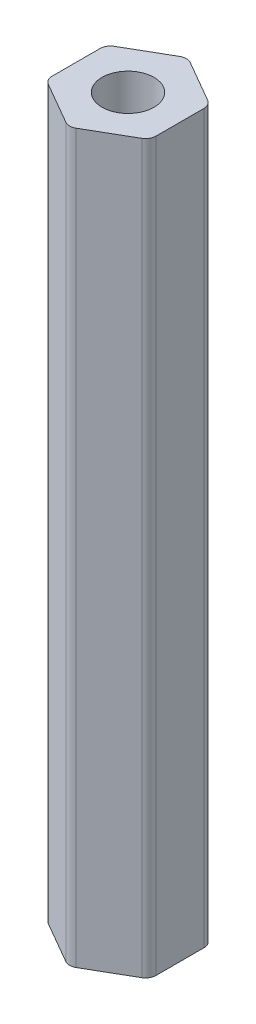
ISO-10303-21;
HEADER;
FILE_DESCRIPTION(('STEP AP214'),'2;1');
FILE_NAME('part.step','',(''),(''),'','','');
FILE_SCHEMA(('AUTOMOTIVE_DESIGN { 1 0 10303 214 1 1 1 1 }'));
ENDSEC;
DATA;
#1=APPLICATION_CONTEXT('core data for automotive mechanical design processes');
#2=APPLICATION_PROTOCOL_DEFINITION('international standard','automotive_design',2000,#1);
#3=PRODUCT_CONTEXT('',#1,'mechanical');
#4=PRODUCT('Part','Part','',(#3));
#5=PRODUCT_RELATED_PRODUCT_CATEGORY('part','',(#4));
#6=PRODUCT_DEFINITION_FORMATION('','',#4);
#7=PRODUCT_DEFINITION_CONTEXT('part definition',#1,'design');
#8=PRODUCT_DEFINITION('design','',#6,#7);
#9=PRODUCT_DEFINITION_SHAPE('','',#8);
#10=(LENGTH_UNIT() NAMED_UNIT(*) SI_UNIT(.MILLI.,.METRE.));
#11=(NAMED_UNIT(*) PLANE_ANGLE_UNIT() SI_UNIT($,.RADIAN.));
#12=(NAMED_UNIT(*) SI_UNIT($,.STERADIAN.) SOLID_ANGLE_UNIT());
#13=UNCERTAINTY_MEASURE_WITH_UNIT(LENGTH_MEASURE(1.E-05),#10,'distance_accuracy_value','');
#14=(GEOMETRIC_REPRESENTATION_CONTEXT(3) GLOBAL_UNCERTAINTY_ASSIGNED_CONTEXT((#13)) GLOBAL_UNIT_ASSIGNED_CONTEXT((#10,
#11,#12)) REPRESENTATION_CONTEXT('',''));
#15=CARTESIAN_POINT('',(0.,0.,0.));
#16=DIRECTION('',(0.,0.,1.));
#17=DIRECTION('',(1.,0.,0.));
#18=AXIS2_PLACEMENT_3D('',#15,#16,#17);
#19=CARTESIAN_POINT('',(0.,8.50000000002638,0.));
#20=DIRECTION('',(0.,-1.,0.));
#21=DIRECTION('',(0.,0.,-1.));
#22=AXIS2_PLACEMENT_3D('',#19,#20,#21);
#23=CONICAL_SURFACE('',#22,1.25000000002728,1.02974425862845);
#24=CARTESIAN_POINT('',(0.,9.25107577387507,0.));
#25=VERTEX_POINT('',#24);
#26=VERTEX_LOOP('',#25);
#27=FACE_BOUND('',#26,.T.);
#28=CARTESIAN_POINT('',(0.,8.49999999999999,0.));
#29=DIRECTION('',(0.,-1.,0.));
#30=DIRECTION('',(0.,0.,-1.));
#31=AXIS2_PLACEMENT_3D('',#28,#29,#30);
#32=CIRCLE('',#31,1.24999999999999);
#33=CARTESIAN_POINT('',(0.,8.49999999999999,-1.24999999999999));
#34=VERTEX_POINT('',#33);
#35=EDGE_CURVE('E186',#34,#34,#32,.T.);
#36=ORIENTED_EDGE('',*,*,#35,.T.);
#37=EDGE_LOOP('',(#36));
#38=FACE_BOUND('',#37,.T.);
#39=ADVANCED_FACE('F17',(#27,#38),#23,.F.);
#40=CARTESIAN_POINT('',(0.,26.4999999998281,0.));
#41=DIRECTION('',(0.,1.,0.));
#42=DIRECTION('',(-1.,0.,0.));
#43=AXIS2_PLACEMENT_3D('',#40,#41,#42);
#44=CONICAL_SURFACE('',#43,1.24999999979991,1.02974425852133);
#45=CARTESIAN_POINT('',(0.,25.7489242260647,-5.6843418860808E-11));
#46=VERTEX_POINT('',#45);
#47=VERTEX_LOOP('',#46);
#48=FACE_BOUND('',#47,.T.);
#49=CARTESIAN_POINT('',(0.,26.5,0.));
#50=DIRECTION('',(0.,1.,0.));
#51=DIRECTION('',(0.,0.,1.));
#52=AXIS2_PLACEMENT_3D('',#49,#50,#51);
#53=CIRCLE('',#52,1.24999999999999);
#54=CARTESIAN_POINT('',(0.,26.5,1.24999999999999));
#55=VERTEX_POINT('',#54);
#56=EDGE_CURVE('E182',#55,#55,#53,.T.);
#57=ORIENTED_EDGE('',*,*,#56,.T.);
#58=EDGE_LOOP('',(#57));
#59=FACE_BOUND('',#58,.T.);
#60=ADVANCED_FACE('F386',(#48,#59),#44,.F.);
#61=CARTESIAN_POINT('',(2.00000000000001,35.,1.15470053837923));
#62=DIRECTION('',(0.,-1.,0.));
#63=DIRECTION('',(0.,0.,-1.));
#64=AXIS2_PLACEMENT_3D('',#61,#62,#63);
#65=CYLINDRICAL_SURFACE('',#64,0.5);
#66=CARTESIAN_POINT('',(2.00000000000001,0.,1.15470053837923));
#67=DIRECTION('',(0.,-1.,0.));
#68=DIRECTION('',(0.,0.,-1.));
#69=AXIS2_PLACEMENT_3D('',#66,#67,#68);
#70=CIRCLE('',#69,0.5);
#71=CARTESIAN_POINT('',(2.25000000000002,0.,1.58771324027145));
#72=VERTEX_POINT('',#71);
#73=CARTESIAN_POINT('',(2.50000000000001,0.,1.15470053837923));
#74=VERTEX_POINT('',#73);
#75=EDGE_CURVE('E111',#72,#74,#70,.F.);
#76=ORIENTED_EDGE('',*,*,#75,.T.);
#77=DIRECTION('',(0.,1.,0.));
#78=VECTOR('',#77,1.);
#79=CARTESIAN_POINT('',(2.50000000000001,35.,1.15470053837923));
#80=LINE('',#79,#78);
#81=CARTESIAN_POINT('',(2.50000000000001,35.,1.15470053837923));
#82=VERTEX_POINT('',#81);
#83=EDGE_CURVE('E109',#74,#82,#80,.T.);
#84=ORIENTED_EDGE('',*,*,#83,.T.);
#85=CARTESIAN_POINT('',(2.00000000000001,35.,1.15470053837923));
#86=DIRECTION('',(0.,-1.,0.));
#87=DIRECTION('',(0.,0.,-1.));
#88=AXIS2_PLACEMENT_3D('',#85,#86,#87);
#89=CIRCLE('',#88,0.5);
#90=CARTESIAN_POINT('',(2.25000000000002,35.,1.58771324027145));
#91=VERTEX_POINT('',#90);
#92=EDGE_CURVE('E20',#82,#91,#89,.T.);
#93=ORIENTED_EDGE('',*,*,#92,.T.);
#94=DIRECTION('',(0.,1.,0.));
#95=VECTOR('',#94,1.);
#96=CARTESIAN_POINT('',(2.25000000000002,35.,1.58771324027145));
#97=LINE('',#96,#95);
#98=EDGE_CURVE('E106',#91,#72,#97,.F.);
#99=ORIENTED_EDGE('',*,*,#98,.T.);
#100=EDGE_LOOP('',(#76,#84,#93,#99));
#101=FACE_BOUND('',#100,.T.);
#102=ADVANCED_FACE('F105',(#101),#65,.T.);
#103=CARTESIAN_POINT('',(1.99999999999999,35.,-1.15470053837928));
#104=DIRECTION('',(0.,-1.,0.));
#105=DIRECTION('',(0.,0.,-1.));
#106=AXIS2_PLACEMENT_3D('',#103,#104,#105);
#107=CYLINDRICAL_SURFACE('',#106,0.5);
#108=CARTESIAN_POINT('',(1.99999999999999,0.,-1.15470053837928));
#109=DIRECTION('',(0.,-1.,0.));
#110=DIRECTION('',(0.,0.,-1.));
#111=AXIS2_PLACEMENT_3D('',#108,#109,#110);
#112=CIRCLE('',#111,0.5);
#113=CARTESIAN_POINT('',(2.5,0.,-1.15470053837928));
#114=VERTEX_POINT('',#113);
#115=CARTESIAN_POINT('',(2.24999999999999,0.,-1.5877132402715));
#116=VERTEX_POINT('',#115);
#117=EDGE_CURVE('E206',#114,#116,#112,.F.);
#118=ORIENTED_EDGE('',*,*,#117,.T.);
#119=DIRECTION('',(0.,1.,0.));
#120=VECTOR('',#119,1.);
#121=CARTESIAN_POINT('',(2.24999999999999,35.,-1.5877132402715));
#122=LINE('',#121,#120);
#123=CARTESIAN_POINT('',(2.24999999999999,35.,-1.5877132402715));
#124=VERTEX_POINT('',#123);
#125=EDGE_CURVE('E171',#116,#124,#122,.T.);
#126=ORIENTED_EDGE('',*,*,#125,.T.);
#127=CARTESIAN_POINT('',(1.99999999999999,35.,-1.15470053837928));
#128=DIRECTION('',(0.,-1.,0.));
#129=DIRECTION('',(0.,0.,-1.));
#130=AXIS2_PLACEMENT_3D('',#127,#128,#129);
#131=CIRCLE('',#130,0.5);
#132=CARTESIAN_POINT('',(2.5,35.,-1.15470053837928));
#133=VERTEX_POINT('',#132);
#134=EDGE_CURVE('E208',#124,#133,#131,.T.);
#135=ORIENTED_EDGE('',*,*,#134,.T.);
#136=DIRECTION('',(0.,1.,0.));
#137=VECTOR('',#136,1.);
#138=CARTESIAN_POINT('',(2.49999999999999,35.,-1.15470053837928));
#139=LINE('',#138,#137);
#140=EDGE_CURVE('E119',#133,#114,#139,.F.);
#141=ORIENTED_EDGE('',*,*,#140,.T.);
#142=EDGE_LOOP('',(#118,#126,#135,#141));
#143=FACE_BOUND('',#142,.T.);
#144=ADVANCED_FACE('F219',(#143),#107,.T.);
#145=CARTESIAN_POINT('',(-2.,35.,1.15470053837926));
#146=DIRECTION('',(0.,-1.,0.));
#147=DIRECTION('',(0.,0.,-1.));
#148=AXIS2_PLACEMENT_3D('',#145,#146,#147);
#149=CYLINDRICAL_SURFACE('',#148,0.5);
#150=CARTESIAN_POINT('',(-2.,0.,1.15470053837926));
#151=DIRECTION('',(0.,-1.,0.));
#152=DIRECTION('',(0.,0.,-1.));
#153=AXIS2_PLACEMENT_3D('',#150,#151,#152);
#154=CIRCLE('',#153,0.5);
#155=CARTESIAN_POINT('',(-2.5,0.,1.15470053837926));
#156=VERTEX_POINT('',#155);
#157=CARTESIAN_POINT('',(-2.24999999999999,0.,1.58771324027148));
#158=VERTEX_POINT('',#157);
#159=EDGE_CURVE('E202',#156,#158,#154,.F.);
#160=ORIENTED_EDGE('',*,*,#159,.T.);
#161=DIRECTION('',(0.,1.,0.));
#162=VECTOR('',#161,1.);
#163=CARTESIAN_POINT('',(-2.24999999999999,35.,1.58771324027148));
#164=LINE('',#163,#162);
#165=CARTESIAN_POINT('',(-2.24999999999999,35.,1.58771324027148));
#166=VERTEX_POINT('',#165);
#167=EDGE_CURVE('E161',#158,#166,#164,.T.);
#168=ORIENTED_EDGE('',*,*,#167,.T.);
#169=CARTESIAN_POINT('',(-2.,35.,1.15470053837926));
#170=DIRECTION('',(0.,-1.,0.));
#171=DIRECTION('',(0.,0.,-1.));
#172=AXIS2_PLACEMENT_3D('',#169,#170,#171);
#173=CIRCLE('',#172,0.5);
#174=CARTESIAN_POINT('',(-2.5,35.,1.15470053837926));
#175=VERTEX_POINT('',#174);
#176=EDGE_CURVE('E204',#166,#175,#173,.T.);
#177=ORIENTED_EDGE('',*,*,#176,.T.);
#178=DIRECTION('',(0.,1.,0.));
#179=VECTOR('',#178,1.);
#180=CARTESIAN_POINT('',(-2.5,35.,1.15470053837926));
#181=LINE('',#180,#179);
#182=EDGE_CURVE('E165',#175,#156,#181,.F.);
#183=ORIENTED_EDGE('',*,*,#182,.T.);
#184=EDGE_LOOP('',(#160,#168,#177,#183));
#185=FACE_BOUND('',#184,.T.);
#186=ADVANCED_FACE('F238',(#185),#149,.T.);
#187=CARTESIAN_POINT('',(0.,35.,2.30940107675851));
#188=DIRECTION('',(0.,-1.,0.));
#189=DIRECTION('',(0.,0.,-1.));
#190=AXIS2_PLACEMENT_3D('',#187,#188,#189);
#191=CYLINDRICAL_SURFACE('',#190,0.5);
#192=CARTESIAN_POINT('',(0.,0.,2.30940107675851));
#193=DIRECTION('',(0.,-1.,0.));
#194=DIRECTION('',(0.,0.,-1.));
#195=AXIS2_PLACEMENT_3D('',#192,#193,#194);
#196=CIRCLE('',#195,0.5);
#197=CARTESIAN_POINT('',(-0.249999999999981,0.,2.74241377865073));
#198=VERTEX_POINT('',#197);
#199=CARTESIAN_POINT('',(0.250000000000019,0.,2.74241377865072));
#200=VERTEX_POINT('',#199);
#201=EDGE_CURVE('E189',#198,#200,#196,.F.);
#202=ORIENTED_EDGE('',*,*,#201,.T.);
#203=DIRECTION('',(0.,1.,0.));
#204=VECTOR('',#203,1.);
#205=CARTESIAN_POINT('',(0.25000000000002,35.,2.74241377865072));
#206=LINE('',#205,#204);
#207=CARTESIAN_POINT('',(0.250000000000019,35.,2.74241377865072));
#208=VERTEX_POINT('',#207);
#209=EDGE_CURVE('E120',#200,#208,#206,.T.);
#210=ORIENTED_EDGE('',*,*,#209,.T.);
#211=CARTESIAN_POINT('',(0.,35.,2.30940107675851));
#212=DIRECTION('',(0.,-1.,0.));
#213=DIRECTION('',(0.,0.,-1.));
#214=AXIS2_PLACEMENT_3D('',#211,#212,#213);
#215=CIRCLE('',#214,0.5);
#216=CARTESIAN_POINT('',(-0.249999999999981,35.,2.74241377865073));
#217=VERTEX_POINT('',#216);
#218=EDGE_CURVE('E125',#208,#217,#215,.T.);
#219=ORIENTED_EDGE('',*,*,#218,.T.);
#220=DIRECTION('',(0.,1.,0.));
#221=VECTOR('',#220,1.);
#222=CARTESIAN_POINT('',(-0.249999999999981,35.,2.74241377865073));
#223=LINE('',#222,#221);
#224=EDGE_CURVE('E164',#217,#198,#223,.F.);
#225=ORIENTED_EDGE('',*,*,#224,.T.);
#226=EDGE_LOOP('',(#202,#210,#219,#225));
#227=FACE_BOUND('',#226,.T.);
#228=ADVANCED_FACE('F234',(#227),#191,.T.);
#229=CARTESIAN_POINT('',(0.,0.,0.));
#230=DIRECTION('',(0.,-1.,0.));
#231=DIRECTION('',(0.,0.,-1.));
#232=AXIS2_PLACEMENT_3D('',#229,#230,#231);
#233=CYLINDRICAL_SURFACE('',#232,1.24999999999999);
#234=ORIENTED_EDGE('',*,*,#35,.F.);
#235=EDGE_LOOP('',(#234));
#236=FACE_BOUND('',#235,.T.);
#237=CARTESIAN_POINT('',(0.,0.,0.));
#238=DIRECTION('',(0.,-1.,0.));
#239=DIRECTION('',(0.,0.,-1.));
#240=AXIS2_PLACEMENT_3D('',#237,#238,#239);
#241=CIRCLE('',#240,1.24999999999999);
#242=CARTESIAN_POINT('',(0.,0.,-1.24999999999999));
#243=VERTEX_POINT('',#242);
#244=EDGE_CURVE('E160',#243,#243,#241,.T.);
#245=ORIENTED_EDGE('',*,*,#244,.T.);
#246=EDGE_LOOP('',(#245));
#247=FACE_BOUND('',#246,.T.);
#248=ADVANCED_FACE('F343',(#236,#247),#233,.F.);
#249=CARTESIAN_POINT('',(0.,35.,0.));
#250=DIRECTION('',(0.,1.,0.));
#251=DIRECTION('',(0.,0.,1.));
#252=AXIS2_PLACEMENT_3D('',#249,#250,#251);
#253=CYLINDRICAL_SURFACE('',#252,1.24999999999999);
#254=CARTESIAN_POINT('',(0.,35.,0.));
#255=DIRECTION('',(0.,1.,0.));
#256=DIRECTION('',(0.,0.,1.));
#257=AXIS2_PLACEMENT_3D('',#254,#255,#256);
#258=CIRCLE('',#257,1.24999999999999);
#259=CARTESIAN_POINT('',(0.,35.,1.24999999999999));
#260=VERTEX_POINT('',#259);
#261=EDGE_CURVE('E128',#260,#260,#258,.F.);
#262=ORIENTED_EDGE('',*,*,#261,.F.);
#263=EDGE_LOOP('',(#262));
#264=FACE_BOUND('',#263,.T.);
#265=ORIENTED_EDGE('',*,*,#56,.F.);
#266=EDGE_LOOP('',(#265));
#267=FACE_BOUND('',#266,.T.);
#268=ADVANCED_FACE('F333',(#264,#267),#253,.F.);
#269=CARTESIAN_POINT('',(0.,35.,2.88675134594813));
#270=DIRECTION('',(-0.500000000000007,0.,-0.866025403784435));
#271=DIRECTION('',(-0.866025403784435,0.,0.500000000000007));
#272=AXIS2_PLACEMENT_3D('',#269,#270,#271);
#273=PLANE('',#272);
#274=ORIENTED_EDGE('',*,*,#98,.F.);
#275=DIRECTION('',(0.866025403784434,0.,-0.500000000000007));
#276=VECTOR('',#275,1.);
#277=CARTESIAN_POINT('',(0.250000000000019,35.,2.74241377865072));
#278=LINE('',#277,#276);
#279=EDGE_CURVE('E116',#208,#91,#278,.T.);
#280=ORIENTED_EDGE('',*,*,#279,.F.);
#281=ORIENTED_EDGE('',*,*,#209,.F.);
#282=DIRECTION('',(0.866025403784434,0.,-0.500000000000007));
#283=VECTOR('',#282,1.);
#284=CARTESIAN_POINT('',(0.250000000000019,0.,2.74241377865072));
#285=LINE('',#284,#283);
#286=EDGE_CURVE('E118',#200,#72,#285,.T.);
#287=ORIENTED_EDGE('',*,*,#286,.T.);
#288=EDGE_LOOP('',(#274,#280,#281,#287));
#289=FACE_BOUND('',#288,.T.);
#290=ADVANCED_FACE('F114',(#289),#273,.F.);
#291=CARTESIAN_POINT('',(2.50000000000002,35.,1.44337567297404));
#292=DIRECTION('',(-1.,0.,0.));
#293=DIRECTION('',(0.,0.,1.));
#294=AXIS2_PLACEMENT_3D('',#291,#292,#293);
#295=PLANE('',#294);
#296=ORIENTED_EDGE('',*,*,#83,.F.);
#297=DIRECTION('',(0.,0.,1.));
#298=VECTOR('',#297,1.);
#299=CARTESIAN_POINT('',(2.50000000000001,0.,0.));
#300=LINE('',#299,#298);
#301=EDGE_CURVE('E146',#74,#114,#300,.F.);
#302=ORIENTED_EDGE('',*,*,#301,.T.);
#303=ORIENTED_EDGE('',*,*,#140,.F.);
#304=DIRECTION('',(0.,0.,1.));
#305=VECTOR('',#304,1.);
#306=CARTESIAN_POINT('',(2.50000000000001,35.,0.));
#307=LINE('',#306,#305);
#308=EDGE_CURVE('E127',#82,#133,#307,.F.);
#309=ORIENTED_EDGE('',*,*,#308,.F.);
#310=EDGE_LOOP('',(#296,#302,#303,#309));
#311=FACE_BOUND('',#310,.T.);
#312=ADVANCED_FACE('F212',(#311),#295,.F.);
#313=CARTESIAN_POINT('',(2.49999999999999,35.,-1.44337567297409));
#314=DIRECTION('',(-0.499999999999995,0.,0.866025403784442));
#315=DIRECTION('',(0.866025403784442,0.,0.499999999999995));
#316=AXIS2_PLACEMENT_3D('',#313,#314,#315);
#317=PLANE('',#316);
#318=ORIENTED_EDGE('',*,*,#125,.F.);
#319=DIRECTION('',(-0.866025403784442,0.,-0.499999999999995));
#320=VECTOR('',#319,1.);
#321=CARTESIAN_POINT('',(2.24999999999999,0.,-1.5877132402715));
#322=LINE('',#321,#320);
#323=CARTESIAN_POINT('',(0.249999999999999,0.,-2.74241377865073));
#324=VERTEX_POINT('',#323);
#325=EDGE_CURVE('E157',#116,#324,#322,.T.);
#326=ORIENTED_EDGE('',*,*,#325,.T.);
#327=DIRECTION('',(0.,1.,0.));
#328=VECTOR('',#327,1.);
#329=CARTESIAN_POINT('',(0.249999999999999,35.,-2.74241377865073));
#330=LINE('',#329,#328);
#331=CARTESIAN_POINT('',(0.249999999999999,35.,-2.74241377865073));
#332=VERTEX_POINT('',#331);
#333=EDGE_CURVE('E176',#332,#324,#330,.F.);
#334=ORIENTED_EDGE('',*,*,#333,.F.);
#335=DIRECTION('',(-0.866025403784442,0.,-0.499999999999995));
#336=VECTOR('',#335,1.);
#337=CARTESIAN_POINT('',(2.24999999999999,35.,-1.5877132402715));
#338=LINE('',#337,#336);
#339=EDGE_CURVE('E130',#124,#332,#338,.T.);
#340=ORIENTED_EDGE('',*,*,#339,.F.);
#341=EDGE_LOOP('',(#318,#326,#334,#340));
#342=FACE_BOUND('',#341,.T.);
#343=ADVANCED_FACE('F223',(#342),#317,.F.);
#344=CARTESIAN_POINT('',(-2.50000000000001,35.,-1.44337567297406));
#345=DIRECTION('',(1.,0.,0.));
#346=DIRECTION('',(0.,0.,-1.));
#347=AXIS2_PLACEMENT_3D('',#344,#345,#346);
#348=PLANE('',#347);
#349=ORIENTED_EDGE('',*,*,#182,.F.);
#350=DIRECTION('',(0.,0.,1.));
#351=VECTOR('',#350,1.);
#352=CARTESIAN_POINT('',(-2.5,35.,0.));
#353=LINE('',#352,#351);
#354=CARTESIAN_POINT('',(-2.5,35.,-1.15470053837925));
#355=VERTEX_POINT('',#354);
#356=EDGE_CURVE('E193',#355,#175,#353,.T.);
#357=ORIENTED_EDGE('',*,*,#356,.F.);
#358=DIRECTION('',(0.,-1.,0.));
#359=VECTOR('',#358,1.);
#360=CARTESIAN_POINT('',(-2.5,35.,-1.15470053837925));
#361=LINE('',#360,#359);
#362=CARTESIAN_POINT('',(-2.5,0.,-1.15470053837925));
#363=VERTEX_POINT('',#362);
#364=EDGE_CURVE('E168',#363,#355,#361,.F.);
#365=ORIENTED_EDGE('',*,*,#364,.F.);
#366=DIRECTION('',(0.,0.,1.));
#367=VECTOR('',#366,1.);
#368=CARTESIAN_POINT('',(-2.5,0.,0.));
#369=LINE('',#368,#367);
#370=EDGE_CURVE('E153',#363,#156,#369,.T.);
#371=ORIENTED_EDGE('',*,*,#370,.T.);
#372=EDGE_LOOP('',(#349,#357,#365,#371));
#373=FACE_BOUND('',#372,.T.);
#374=ADVANCED_FACE('F241',(#373),#348,.F.);
#375=CARTESIAN_POINT('',(-2.5,35.,1.44337567297408));
#376=DIRECTION('',(0.499999999999995,0.,-0.866025403784442));
#377=DIRECTION('',(-0.866025403784442,0.,-0.499999999999995));
#378=AXIS2_PLACEMENT_3D('',#375,#376,#377);
#379=PLANE('',#378);
#380=ORIENTED_EDGE('',*,*,#224,.F.);
#381=DIRECTION('',(0.866025403784442,0.,0.499999999999995));
#382=VECTOR('',#381,1.);
#383=CARTESIAN_POINT('',(-2.24999999999999,35.,1.58771324027148));
#384=LINE('',#383,#382);
#385=EDGE_CURVE('E143',#166,#217,#384,.T.);
#386=ORIENTED_EDGE('',*,*,#385,.F.);
#387=ORIENTED_EDGE('',*,*,#167,.F.);
#388=DIRECTION('',(0.866025403784442,0.,0.499999999999995));
#389=VECTOR('',#388,1.);
#390=CARTESIAN_POINT('',(-2.24999999999999,0.,1.58771324027148));
#391=LINE('',#390,#389);
#392=EDGE_CURVE('E150',#158,#198,#391,.T.);
#393=ORIENTED_EDGE('',*,*,#392,.T.);
#394=EDGE_LOOP('',(#380,#386,#387,#393));
#395=FACE_BOUND('',#394,.T.);
#396=ADVANCED_FACE('F231',(#395),#379,.F.);
#397=CARTESIAN_POINT('',(-2.,35.,-1.15470053837925));
#398=DIRECTION('',(0.,-1.,0.));
#399=DIRECTION('',(0.,0.,-1.));
#400=AXIS2_PLACEMENT_3D('',#397,#398,#399);
#401=CYLINDRICAL_SURFACE('',#400,0.5);
#402=CARTESIAN_POINT('',(-2.,0.,-1.15470053837925));
#403=DIRECTION('',(0.,-1.,0.));
#404=DIRECTION('',(0.,0.,-1.));
#405=AXIS2_PLACEMENT_3D('',#402,#403,#404);
#406=CIRCLE('',#405,0.5);
#407=CARTESIAN_POINT('',(-2.25000000000001,0.,-1.58771324027147));
#408=VERTEX_POINT('',#407);
#409=EDGE_CURVE('E156',#408,#363,#406,.F.);
#410=ORIENTED_EDGE('',*,*,#409,.T.);
#411=ORIENTED_EDGE('',*,*,#364,.T.);
#412=CARTESIAN_POINT('',(-2.,35.,-1.15470053837925));
#413=DIRECTION('',(0.,-1.,0.));
#414=DIRECTION('',(0.,0.,-1.));
#415=AXIS2_PLACEMENT_3D('',#412,#413,#414);
#416=CIRCLE('',#415,0.5);
#417=CARTESIAN_POINT('',(-2.25000000000001,35.,-1.58771324027147));
#418=VERTEX_POINT('',#417);
#419=EDGE_CURVE('E190',#418,#355,#416,.F.);
#420=ORIENTED_EDGE('',*,*,#419,.F.);
#421=DIRECTION('',(0.,1.,0.));
#422=VECTOR('',#421,1.);
#423=CARTESIAN_POINT('',(-2.25000000000001,35.,-1.58771324027147));
#424=LINE('',#423,#422);
#425=EDGE_CURVE('E140',#418,#408,#424,.F.);
#426=ORIENTED_EDGE('',*,*,#425,.T.);
#427=EDGE_LOOP('',(#410,#411,#420,#426));
#428=FACE_BOUND('',#427,.T.);
#429=ADVANCED_FACE('F244',(#428),#401,.T.);
#430=CARTESIAN_POINT('',(0.,0.,0.));
#431=DIRECTION('',(0.,1.,0.));
#432=DIRECTION('',(0.,0.,1.));
#433=AXIS2_PLACEMENT_3D('',#430,#431,#432);
#434=PLANE('',#433);
#435=ORIENTED_EDGE('',*,*,#75,.F.);
#436=ORIENTED_EDGE('',*,*,#286,.F.);
#437=ORIENTED_EDGE('',*,*,#201,.F.);
#438=ORIENTED_EDGE('',*,*,#392,.F.);
#439=ORIENTED_EDGE('',*,*,#159,.F.);
#440=ORIENTED_EDGE('',*,*,#370,.F.);
#441=ORIENTED_EDGE('',*,*,#409,.F.);
#442=DIRECTION('',(0.866025403784438,0.,-0.500000000000001));
#443=VECTOR('',#442,1.);
#444=CARTESIAN_POINT('',(0.,0.,-2.88675134594813));
#445=LINE('',#444,#443);
#446=CARTESIAN_POINT('',(-0.249999999999999,0.,-2.74241377865073));
#447=VERTEX_POINT('',#446);
#448=EDGE_CURVE('E138',#408,#447,#445,.T.);
#449=ORIENTED_EDGE('',*,*,#448,.T.);
#450=CARTESIAN_POINT('',(0.,0.,-2.30940107675851));
#451=DIRECTION('',(0.,-1.,0.));
#452=DIRECTION('',(0.,0.,-1.));
#453=AXIS2_PLACEMENT_3D('',#450,#451,#452);
#454=CIRCLE('',#453,0.5);
#455=EDGE_CURVE('E133',#324,#447,#454,.F.);
#456=ORIENTED_EDGE('',*,*,#455,.F.);
#457=ORIENTED_EDGE('',*,*,#325,.F.);
#458=ORIENTED_EDGE('',*,*,#117,.F.);
#459=ORIENTED_EDGE('',*,*,#301,.F.);
#460=EDGE_LOOP('',(#435,#436,#437,#438,#439,#440,#441,#449,#456,#457,#458,#459));
#461=FACE_BOUND('',#460,.T.);
#462=ORIENTED_EDGE('',*,*,#244,.F.);
#463=EDGE_LOOP('',(#462));
#464=FACE_BOUND('',#463,.T.);
#465=ADVANCED_FACE('F214',(#461,#464),#434,.F.);
#466=CARTESIAN_POINT('',(0.,35.,-2.30940107675851));
#467=DIRECTION('',(0.,-1.,0.));
#468=DIRECTION('',(0.,0.,-1.));
#469=AXIS2_PLACEMENT_3D('',#466,#467,#468);
#470=CYLINDRICAL_SURFACE('',#469,0.5);
#471=ORIENTED_EDGE('',*,*,#455,.T.);
#472=DIRECTION('',(0.,1.,0.));
#473=VECTOR('',#472,1.);
#474=CARTESIAN_POINT('',(-0.249999999999999,35.,-2.74241377865073));
#475=LINE('',#474,#473);
#476=CARTESIAN_POINT('',(-0.249999999999999,35.,-2.74241377865073));
#477=VERTEX_POINT('',#476);
#478=EDGE_CURVE('E26',#447,#477,#475,.T.);
#479=ORIENTED_EDGE('',*,*,#478,.T.);
#480=CARTESIAN_POINT('',(0.,35.,-2.30940107675851));
#481=DIRECTION('',(0.,-1.,0.));
#482=DIRECTION('',(0.,0.,-1.));
#483=AXIS2_PLACEMENT_3D('',#480,#481,#482);
#484=CIRCLE('',#483,0.5);
#485=EDGE_CURVE('E34',#332,#477,#484,.F.);
#486=ORIENTED_EDGE('',*,*,#485,.F.);
#487=ORIENTED_EDGE('',*,*,#333,.T.);
#488=EDGE_LOOP('',(#471,#479,#486,#487));
#489=FACE_BOUND('',#488,.T.);
#490=ADVANCED_FACE('F251',(#489),#470,.T.);
#491=CARTESIAN_POINT('',(0.,35.,0.));
#492=DIRECTION('',(0.,1.,0.));
#493=DIRECTION('',(0.,0.,1.));
#494=AXIS2_PLACEMENT_3D('',#491,#492,#493);
#495=PLANE('',#494);
#496=ORIENTED_EDGE('',*,*,#385,.T.);
#497=ORIENTED_EDGE('',*,*,#218,.F.);
#498=ORIENTED_EDGE('',*,*,#279,.T.);
#499=ORIENTED_EDGE('',*,*,#92,.F.);
#500=ORIENTED_EDGE('',*,*,#308,.T.);
#501=ORIENTED_EDGE('',*,*,#134,.F.);
#502=ORIENTED_EDGE('',*,*,#339,.T.);
#503=ORIENTED_EDGE('',*,*,#485,.T.);
#504=DIRECTION('',(0.866025403784438,0.,-0.500000000000001));
#505=VECTOR('',#504,1.);
#506=CARTESIAN_POINT('',(0.,35.,-2.88675134594813));
#507=LINE('',#506,#505);
#508=EDGE_CURVE('E11',#477,#418,#507,.F.);
#509=ORIENTED_EDGE('',*,*,#508,.T.);
#510=ORIENTED_EDGE('',*,*,#419,.T.);
#511=ORIENTED_EDGE('',*,*,#356,.T.);
#512=ORIENTED_EDGE('',*,*,#176,.F.);
#513=EDGE_LOOP('',(#496,#497,#498,#499,#500,#501,#502,#503,#509,#510,#511,#512));
#514=FACE_BOUND('',#513,.T.);
#515=ORIENTED_EDGE('',*,*,#261,.T.);
#516=EDGE_LOOP('',(#515));
#517=FACE_BOUND('',#516,.T.);
#518=ADVANCED_FACE('F123',(#514,#517),#495,.T.);
#519=CARTESIAN_POINT('',(0.,35.,-2.88675134594813));
#520=DIRECTION('',(0.500000000000001,0.,0.866025403784438));
#521=DIRECTION('',(0.866025403784438,0.,-0.500000000000001));
#522=AXIS2_PLACEMENT_3D('',#519,#520,#521);
#523=PLANE('',#522);
#524=ORIENTED_EDGE('',*,*,#478,.F.);
#525=ORIENTED_EDGE('',*,*,#448,.F.);
#526=ORIENTED_EDGE('',*,*,#425,.F.);
#527=ORIENTED_EDGE('',*,*,#508,.F.);
#528=EDGE_LOOP('',(#524,#525,#526,#527));
#529=FACE_BOUND('',#528,.T.);
#530=ADVANCED_FACE('F248',(#529),#523,.F.);
#531=CLOSED_SHELL('',(#39,#60,#102,#144,#186,#228,#248,#268,#290,#312,#343,#374,#396,#429,#465,
#490,#518,#530));
#532=MANIFOLD_SOLID_BREP('B1',#531);
#533=ADVANCED_BREP_SHAPE_REPRESENTATION('',(#18,#532),#14);
#534=SHAPE_DEFINITION_REPRESENTATION(#9,#533);
ENDSEC;
END-ISO-10303-21;
